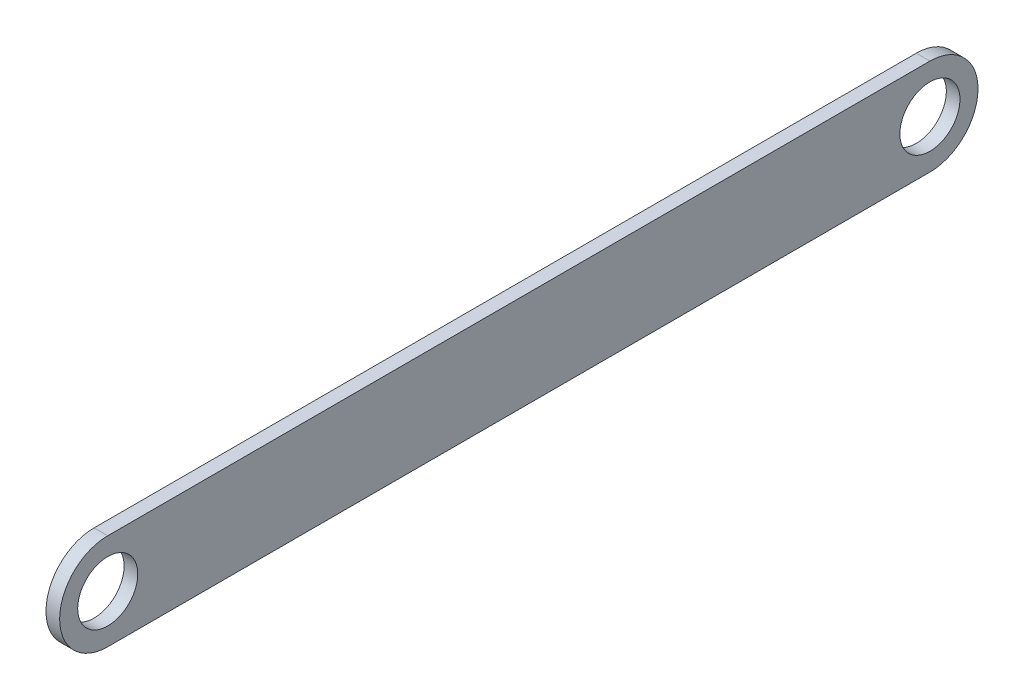
ISO-10303-21;
HEADER;
FILE_DESCRIPTION(('STEP AP214'),'2;1');
FILE_NAME('part.step','',(''),(''),'','','');
FILE_SCHEMA(('AUTOMOTIVE_DESIGN { 1 0 10303 214 1 1 1 1 }'));
ENDSEC;
DATA;
#1=APPLICATION_CONTEXT('core data for automotive mechanical design processes');
#2=APPLICATION_PROTOCOL_DEFINITION('international standard','automotive_design',2000,#1);
#3=PRODUCT_CONTEXT('',#1,'mechanical');
#4=PRODUCT('Part','Part','',(#3));
#5=PRODUCT_RELATED_PRODUCT_CATEGORY('part','',(#4));
#6=PRODUCT_DEFINITION_FORMATION('','',#4);
#7=PRODUCT_DEFINITION_CONTEXT('part definition',#1,'design');
#8=PRODUCT_DEFINITION('design','',#6,#7);
#9=PRODUCT_DEFINITION_SHAPE('','',#8);
#10=(LENGTH_UNIT() NAMED_UNIT(*) SI_UNIT(.MILLI.,.METRE.));
#11=(NAMED_UNIT(*) PLANE_ANGLE_UNIT() SI_UNIT($,.RADIAN.));
#12=(NAMED_UNIT(*) SI_UNIT($,.STERADIAN.) SOLID_ANGLE_UNIT());
#13=UNCERTAINTY_MEASURE_WITH_UNIT(LENGTH_MEASURE(1.E-05),#10,'distance_accuracy_value','');
#14=(GEOMETRIC_REPRESENTATION_CONTEXT(3) GLOBAL_UNCERTAINTY_ASSIGNED_CONTEXT((#13)) GLOBAL_UNIT_ASSIGNED_CONTEXT((#10,
#11,#12)) REPRESENTATION_CONTEXT('',''));
#15=CARTESIAN_POINT('',(0.,0.,0.));
#16=DIRECTION('',(0.,0.,1.));
#17=DIRECTION('',(1.,0.,0.));
#18=AXIS2_PLACEMENT_3D('',#15,#16,#17);
#19=CARTESIAN_POINT('',(28.829,0.,0.));
#20=DIRECTION('',(1.,0.,0.));
#21=DIRECTION('',(0.,0.,-1.));
#22=AXIS2_PLACEMENT_3D('',#19,#20,#21);
#23=PLANE('',#22);
#24=CARTESIAN_POINT('',(28.829,0.,0.));
#25=DIRECTION('',(1.,0.,0.));
#26=DIRECTION('',(0.,0.,-1.));
#27=AXIS2_PLACEMENT_3D('',#24,#25,#26);
#28=CIRCLE('',#27,63.5);
#29=CARTESIAN_POINT('',(28.829,0.,63.5));
#30=VERTEX_POINT('',#29);
#31=EDGE_CURVE('E100',#30,#30,#28,.T.);
#32=ORIENTED_EDGE('',*,*,#31,.F.);
#33=EDGE_LOOP('',(#32));
#34=FACE_BOUND('',#33,.T.);
#35=CARTESIAN_POINT('',(28.829,0.,0.));
#36=DIRECTION('',(1.,0.,0.));
#37=DIRECTION('',(0.,0.,-1.));
#38=AXIS2_PLACEMENT_3D('',#35,#36,#37);
#39=CIRCLE('',#38,101.6);
#40=CARTESIAN_POINT('',(28.829,101.6,0.));
#41=VERTEX_POINT('',#40);
#42=CARTESIAN_POINT('',(28.829,-101.6,0.));
#43=VERTEX_POINT('',#42);
#44=EDGE_CURVE('E85',#41,#43,#39,.T.);
#45=ORIENTED_EDGE('',*,*,#44,.T.);
#46=DIRECTION('',(0.,0.,-1.));
#47=VECTOR('',#46,1.);
#48=CARTESIAN_POINT('',(28.829,-101.6,0.));
#49=LINE('',#48,#47);
#50=CARTESIAN_POINT('',(28.829,-101.6,-1737.36));
#51=VERTEX_POINT('',#50);
#52=EDGE_CURVE('E80',#43,#51,#49,.T.);
#53=ORIENTED_EDGE('',*,*,#52,.T.);
#54=CARTESIAN_POINT('',(28.829,0.,-1737.36));
#55=DIRECTION('',(1.,0.,0.));
#56=DIRECTION('',(0.,0.,-1.));
#57=AXIS2_PLACEMENT_3D('',#54,#55,#56);
#58=CIRCLE('',#57,101.6);
#59=CARTESIAN_POINT('',(28.829,101.6,-1737.36));
#60=VERTEX_POINT('',#59);
#61=EDGE_CURVE('E83',#51,#60,#58,.T.);
#62=ORIENTED_EDGE('',*,*,#61,.T.);
#63=DIRECTION('',(0.,0.,1.));
#64=VECTOR('',#63,1.);
#65=CARTESIAN_POINT('',(28.829,101.6,0.));
#66=LINE('',#65,#64);
#67=EDGE_CURVE('E50',#60,#41,#66,.T.);
#68=ORIENTED_EDGE('',*,*,#67,.T.);
#69=EDGE_LOOP('',(#45,#53,#62,#68));
#70=FACE_BOUND('',#69,.T.);
#71=CARTESIAN_POINT('',(28.829,0.,-1737.36));
#72=DIRECTION('',(1.,0.,0.));
#73=DIRECTION('',(0.,0.,-1.));
#74=AXIS2_PLACEMENT_3D('',#71,#72,#73);
#75=CIRCLE('',#74,63.5000000000001);
#76=CARTESIAN_POINT('',(28.829,0.,-1673.86));
#77=VERTEX_POINT('',#76);
#78=EDGE_CURVE('E115',#77,#77,#75,.T.);
#79=ORIENTED_EDGE('',*,*,#78,.F.);
#80=EDGE_LOOP('',(#79));
#81=FACE_BOUND('',#80,.T.);
#82=ADVANCED_FACE('F33',(#34,#70,#81),#23,.T.);
#83=CARTESIAN_POINT('',(0.,0.,0.));
#84=DIRECTION('',(1.,0.,0.));
#85=DIRECTION('',(0.,0.,-1.));
#86=AXIS2_PLACEMENT_3D('',#83,#84,#85);
#87=PLANE('',#86);
#88=CARTESIAN_POINT('',(0.,0.,0.));
#89=DIRECTION('',(1.,0.,0.));
#90=DIRECTION('',(0.,0.,-1.));
#91=AXIS2_PLACEMENT_3D('',#88,#89,#90);
#92=CIRCLE('',#91,101.6);
#93=CARTESIAN_POINT('',(0.,101.6,0.));
#94=VERTEX_POINT('',#93);
#95=CARTESIAN_POINT('',(0.,-101.6,0.));
#96=VERTEX_POINT('',#95);
#97=EDGE_CURVE('E97',#94,#96,#92,.T.);
#98=ORIENTED_EDGE('',*,*,#97,.F.);
#99=DIRECTION('',(0.,0.,1.));
#100=VECTOR('',#99,1.);
#101=CARTESIAN_POINT('',(0.,101.6,0.));
#102=LINE('',#101,#100);
#103=CARTESIAN_POINT('',(0.,101.6,-1737.36));
#104=VERTEX_POINT('',#103);
#105=EDGE_CURVE('E73',#104,#94,#102,.T.);
#106=ORIENTED_EDGE('',*,*,#105,.F.);
#107=CARTESIAN_POINT('',(0.,0.,-1737.36));
#108=DIRECTION('',(1.,0.,0.));
#109=DIRECTION('',(0.,0.,-1.));
#110=AXIS2_PLACEMENT_3D('',#107,#108,#109);
#111=CIRCLE('',#110,101.6);
#112=CARTESIAN_POINT('',(0.,-101.6,-1737.36));
#113=VERTEX_POINT('',#112);
#114=EDGE_CURVE('E67',#113,#104,#111,.T.);
#115=ORIENTED_EDGE('',*,*,#114,.F.);
#116=DIRECTION('',(0.,0.,-1.));
#117=VECTOR('',#116,1.);
#118=CARTESIAN_POINT('',(0.,-101.6,0.));
#119=LINE('',#118,#117);
#120=EDGE_CURVE('E89',#96,#113,#119,.T.);
#121=ORIENTED_EDGE('',*,*,#120,.F.);
#122=EDGE_LOOP('',(#98,#106,#115,#121));
#123=FACE_BOUND('',#122,.T.);
#124=CARTESIAN_POINT('',(0.,0.,0.));
#125=DIRECTION('',(1.,0.,0.));
#126=DIRECTION('',(0.,0.,-1.));
#127=AXIS2_PLACEMENT_3D('',#124,#125,#126);
#128=CIRCLE('',#127,63.5);
#129=CARTESIAN_POINT('',(0.,0.,63.5));
#130=VERTEX_POINT('',#129);
#131=EDGE_CURVE('E112',#130,#130,#128,.T.);
#132=ORIENTED_EDGE('',*,*,#131,.T.);
#133=EDGE_LOOP('',(#132));
#134=FACE_BOUND('',#133,.T.);
#135=CARTESIAN_POINT('',(0.,0.,-1737.36));
#136=DIRECTION('',(1.,0.,0.));
#137=DIRECTION('',(0.,0.,-1.));
#138=AXIS2_PLACEMENT_3D('',#135,#136,#137);
#139=CIRCLE('',#138,63.5000000000001);
#140=CARTESIAN_POINT('',(0.,0.,-1673.86));
#141=VERTEX_POINT('',#140);
#142=EDGE_CURVE('E118',#141,#141,#139,.T.);
#143=ORIENTED_EDGE('',*,*,#142,.T.);
#144=EDGE_LOOP('',(#143));
#145=FACE_BOUND('',#144,.T.);
#146=ADVANCED_FACE('F108',(#123,#134,#145),#87,.F.);
#147=CARTESIAN_POINT('',(28.829,0.,0.));
#148=DIRECTION('',(-1.,0.,0.));
#149=DIRECTION('',(0.,0.,1.));
#150=AXIS2_PLACEMENT_3D('',#147,#148,#149);
#151=CYLINDRICAL_SURFACE('',#150,101.6);
#152=ORIENTED_EDGE('',*,*,#97,.T.);
#153=DIRECTION('',(-1.,0.,0.));
#154=VECTOR('',#153,1.);
#155=CARTESIAN_POINT('',(28.829,-101.6,0.));
#156=LINE('',#155,#154);
#157=EDGE_CURVE('E11',#43,#96,#156,.T.);
#158=ORIENTED_EDGE('',*,*,#157,.F.);
#159=ORIENTED_EDGE('',*,*,#44,.F.);
#160=DIRECTION('',(-1.,0.,0.));
#161=VECTOR('',#160,1.);
#162=CARTESIAN_POINT('',(28.829,101.6,0.));
#163=LINE('',#162,#161);
#164=EDGE_CURVE('E93',#41,#94,#163,.T.);
#165=ORIENTED_EDGE('',*,*,#164,.T.);
#166=EDGE_LOOP('',(#152,#158,#159,#165));
#167=FACE_BOUND('',#166,.T.);
#168=ADVANCED_FACE('F35',(#167),#151,.T.);
#169=CARTESIAN_POINT('',(28.829,-101.6,0.));
#170=DIRECTION('',(0.,1.,0.));
#171=DIRECTION('',(0.,0.,1.));
#172=AXIS2_PLACEMENT_3D('',#169,#170,#171);
#173=PLANE('',#172);
#174=ORIENTED_EDGE('',*,*,#120,.T.);
#175=DIRECTION('',(-1.,0.,0.));
#176=VECTOR('',#175,1.);
#177=CARTESIAN_POINT('',(28.829,-101.6,-1737.36));
#178=LINE('',#177,#176);
#179=EDGE_CURVE('E42',#51,#113,#178,.T.);
#180=ORIENTED_EDGE('',*,*,#179,.F.);
#181=ORIENTED_EDGE('',*,*,#52,.F.);
#182=ORIENTED_EDGE('',*,*,#157,.T.);
#183=EDGE_LOOP('',(#174,#180,#181,#182));
#184=FACE_BOUND('',#183,.T.);
#185=ADVANCED_FACE('F88',(#184),#173,.F.);
#186=CARTESIAN_POINT('',(28.829,0.,-1737.36));
#187=DIRECTION('',(-1.,0.,0.));
#188=DIRECTION('',(0.,0.,1.));
#189=AXIS2_PLACEMENT_3D('',#186,#187,#188);
#190=CYLINDRICAL_SURFACE('',#189,101.6);
#191=ORIENTED_EDGE('',*,*,#114,.T.);
#192=DIRECTION('',(-1.,0.,0.));
#193=VECTOR('',#192,1.);
#194=CARTESIAN_POINT('',(28.829,101.6,-1737.36));
#195=LINE('',#194,#193);
#196=EDGE_CURVE('E90',#60,#104,#195,.T.);
#197=ORIENTED_EDGE('',*,*,#196,.F.);
#198=ORIENTED_EDGE('',*,*,#61,.F.);
#199=ORIENTED_EDGE('',*,*,#179,.T.);
#200=EDGE_LOOP('',(#191,#197,#198,#199));
#201=FACE_BOUND('',#200,.T.);
#202=ADVANCED_FACE('F91',(#201),#190,.T.);
#203=CARTESIAN_POINT('',(28.829,101.6,0.));
#204=DIRECTION('',(0.,-1.,0.));
#205=DIRECTION('',(0.,0.,-1.));
#206=AXIS2_PLACEMENT_3D('',#203,#204,#205);
#207=PLANE('',#206);
#208=ORIENTED_EDGE('',*,*,#105,.T.);
#209=ORIENTED_EDGE('',*,*,#164,.F.);
#210=ORIENTED_EDGE('',*,*,#67,.F.);
#211=ORIENTED_EDGE('',*,*,#196,.T.);
#212=EDGE_LOOP('',(#208,#209,#210,#211));
#213=FACE_BOUND('',#212,.T.);
#214=ADVANCED_FACE('F105',(#213),#207,.F.);
#215=CARTESIAN_POINT('',(28.829,0.,0.));
#216=DIRECTION('',(-1.,0.,0.));
#217=DIRECTION('',(0.,0.,1.));
#218=AXIS2_PLACEMENT_3D('',#215,#216,#217);
#219=CYLINDRICAL_SURFACE('',#218,63.5);
#220=CARTESIAN_POINT('',(28.829,0.,63.5));
#221=CARTESIAN_POINT('',(28.5286979166667,0.,63.5));
#222=CARTESIAN_POINT('',(28.2283958333333,0.,63.5));
#223=CARTESIAN_POINT('',(27.6277916666667,0.,63.5));
#224=CARTESIAN_POINT('',(27.3274895833333,0.,63.5));
#225=CARTESIAN_POINT('',(26.7268854166667,0.,63.5));
#226=CARTESIAN_POINT('',(26.4265833333333,0.,63.5));
#227=CARTESIAN_POINT('',(25.8259791666667,0.,63.5));
#228=CARTESIAN_POINT('',(25.5256770833333,0.,63.5));
#229=CARTESIAN_POINT('',(24.9250729166667,0.,63.5));
#230=CARTESIAN_POINT('',(24.6247708333333,0.,63.5));
#231=CARTESIAN_POINT('',(24.0241666666667,0.,63.5));
#232=CARTESIAN_POINT('',(23.7238645833333,0.,63.5));
#233=CARTESIAN_POINT('',(23.1232604166667,0.,63.5));
#234=CARTESIAN_POINT('',(22.8229583333333,0.,63.5));
#235=CARTESIAN_POINT('',(22.2223541666667,0.,63.5));
#236=CARTESIAN_POINT('',(21.9220520833333,0.,63.5));
#237=CARTESIAN_POINT('',(21.3214479166667,0.,63.5));
#238=CARTESIAN_POINT('',(21.0211458333333,0.,63.5));
#239=CARTESIAN_POINT('',(20.4205416666667,0.,63.5));
#240=CARTESIAN_POINT('',(20.1202395833333,0.,63.5));
#241=CARTESIAN_POINT('',(19.5196354166667,0.,63.5));
#242=CARTESIAN_POINT('',(19.2193333333333,0.,63.5));
#243=CARTESIAN_POINT('',(18.6187291666667,0.,63.5));
#244=CARTESIAN_POINT('',(18.3184270833333,0.,63.5));
#245=CARTESIAN_POINT('',(17.7178229166667,0.,63.5));
#246=CARTESIAN_POINT('',(17.4175208333333,0.,63.5));
#247=CARTESIAN_POINT('',(16.8169166666667,0.,63.5));
#248=CARTESIAN_POINT('',(16.5166145833333,0.,63.5));
#249=CARTESIAN_POINT('',(15.9160104166667,0.,63.5));
#250=CARTESIAN_POINT('',(15.6157083333333,0.,63.5));
#251=CARTESIAN_POINT('',(15.0151041666667,0.,63.5));
#252=CARTESIAN_POINT('',(14.7148020833333,0.,63.5));
#253=CARTESIAN_POINT('',(14.1141979166667,0.,63.5));
#254=CARTESIAN_POINT('',(13.8138958333333,0.,63.5));
#255=CARTESIAN_POINT('',(13.2132916666667,0.,63.5));
#256=CARTESIAN_POINT('',(12.9129895833333,0.,63.5));
#257=CARTESIAN_POINT('',(12.3123854166667,0.,63.5));
#258=CARTESIAN_POINT('',(12.0120833333333,0.,63.5));
#259=CARTESIAN_POINT('',(11.4114791666667,0.,63.5));
#260=CARTESIAN_POINT('',(11.1111770833333,0.,63.5));
#261=CARTESIAN_POINT('',(10.5105729166667,0.,63.5));
#262=CARTESIAN_POINT('',(10.2102708333333,0.,63.5));
#263=CARTESIAN_POINT('',(9.60966666666666,0.,63.5));
#264=CARTESIAN_POINT('',(9.30936458333333,0.,63.5));
#265=CARTESIAN_POINT('',(8.70876041666666,0.,63.5));
#266=CARTESIAN_POINT('',(8.40845833333333,0.,63.5));
#267=CARTESIAN_POINT('',(7.80785416666667,0.,63.5));
#268=CARTESIAN_POINT('',(7.50755208333333,0.,63.5));
#269=CARTESIAN_POINT('',(6.90694791666666,0.,63.5));
#270=CARTESIAN_POINT('',(6.60664583333333,0.,63.5));
#271=CARTESIAN_POINT('',(6.00604166666667,0.,63.5));
#272=CARTESIAN_POINT('',(5.70573958333333,0.,63.5));
#273=CARTESIAN_POINT('',(5.10513541666667,0.,63.5));
#274=CARTESIAN_POINT('',(4.80483333333333,0.,63.5));
#275=CARTESIAN_POINT('',(4.20422916666666,0.,63.5));
#276=CARTESIAN_POINT('',(3.90392708333333,0.,63.5));
#277=CARTESIAN_POINT('',(3.30332291666666,0.,63.5));
#278=CARTESIAN_POINT('',(3.00302083333333,0.,63.5));
#279=CARTESIAN_POINT('',(2.40241666666666,0.,63.5));
#280=CARTESIAN_POINT('',(2.10211458333333,0.,63.5));
#281=CARTESIAN_POINT('',(1.50151041666666,0.,63.5));
#282=CARTESIAN_POINT('',(1.20120833333333,0.,63.5));
#283=CARTESIAN_POINT('',(0.600604166666663,0.,63.5));
#284=CARTESIAN_POINT('',(0.300302083333329,0.,63.5));
#285=CARTESIAN_POINT('',(0.,0.,63.5));
#286=B_SPLINE_CURVE_WITH_KNOTS('',3,(#220,#221,#222,#223,#224,#225,#226,#227,#228,#229,#230,
#231,#232,#233,#234,#235,#236,#237,#238,#239,#240,#241,#242,#243,#244,#245,#246,#247,#248,#249,
#250,#251,#252,#253,#254,#255,#256,#257,#258,#259,#260,#261,#262,#263,#264,#265,#266,#267,#268,
#269,#270,#271,#272,#273,#274,#275,#276,#277,#278,#279,#280,#281,#282,#283,#284,#285),
.UNSPECIFIED.,.F.,.F.,(4,2,2,2,2,2,2,2,2,2,2,2,2,2,2,2,2,2,2,2,2,2,2,2,2,2,2,2,2,2,2,2,4),(0.,
0.900906250000003,1.8018125,2.70271875,3.603625,4.50453125,5.4054375,6.30634375,7.20725,
8.10815625,9.0090625,9.90996875,10.810875,11.71178125,12.6126875,13.51359375,14.4145,
15.31540625,16.2163125,17.11721875,18.018125,18.91903125,19.8199375,20.72084375,21.62175,
22.52265625,23.4235625,24.32446875,25.225375,26.12628125,27.0271875,27.92809375,28.829),.UNSPECIFIED.);
#287=EDGE_CURVE('BSEAM135',#30,#130,#286,.T.);
#288=ORIENTED_EDGE('',*,*,#31,.T.);
#289=ORIENTED_EDGE('',*,*,#131,.F.);
#290=ORIENTED_EDGE('',*,*,#287,.T.);
#291=ORIENTED_EDGE('',*,*,#287,.F.);
#292=EDGE_LOOP('',(#288,#290,#289,#291));
#293=FACE_BOUND('',#292,.T.);
#294=ADVANCED_FACE('F135',(#293),#219,.F.);
#295=CARTESIAN_POINT('',(28.829,0.,-1737.36));
#296=DIRECTION('',(-1.,0.,0.));
#297=DIRECTION('',(0.,0.,1.));
#298=AXIS2_PLACEMENT_3D('',#295,#296,#297);
#299=CYLINDRICAL_SURFACE('',#298,63.5000000000001);
#300=CARTESIAN_POINT('',(28.829,0.,-1673.86));
#301=CARTESIAN_POINT('',(28.5286979166667,0.,-1673.86));
#302=CARTESIAN_POINT('',(28.2283958333333,0.,-1673.86));
#303=CARTESIAN_POINT('',(27.6277916666667,0.,-1673.86));
#304=CARTESIAN_POINT('',(27.3274895833333,0.,-1673.86));
#305=CARTESIAN_POINT('',(26.7268854166667,0.,-1673.86));
#306=CARTESIAN_POINT('',(26.4265833333333,0.,-1673.86));
#307=CARTESIAN_POINT('',(25.8259791666667,0.,-1673.86));
#308=CARTESIAN_POINT('',(25.5256770833333,0.,-1673.86));
#309=CARTESIAN_POINT('',(24.9250729166667,0.,-1673.86));
#310=CARTESIAN_POINT('',(24.6247708333333,0.,-1673.86));
#311=CARTESIAN_POINT('',(24.0241666666667,0.,-1673.86));
#312=CARTESIAN_POINT('',(23.7238645833333,0.,-1673.86));
#313=CARTESIAN_POINT('',(23.1232604166667,0.,-1673.86));
#314=CARTESIAN_POINT('',(22.8229583333333,0.,-1673.86));
#315=CARTESIAN_POINT('',(22.2223541666667,0.,-1673.86));
#316=CARTESIAN_POINT('',(21.9220520833333,0.,-1673.86));
#317=CARTESIAN_POINT('',(21.3214479166667,0.,-1673.86));
#318=CARTESIAN_POINT('',(21.0211458333333,0.,-1673.86));
#319=CARTESIAN_POINT('',(20.4205416666667,0.,-1673.86));
#320=CARTESIAN_POINT('',(20.1202395833333,0.,-1673.86));
#321=CARTESIAN_POINT('',(19.5196354166667,0.,-1673.86));
#322=CARTESIAN_POINT('',(19.2193333333333,0.,-1673.86));
#323=CARTESIAN_POINT('',(18.6187291666667,0.,-1673.86));
#324=CARTESIAN_POINT('',(18.3184270833333,0.,-1673.86));
#325=CARTESIAN_POINT('',(17.7178229166667,0.,-1673.86));
#326=CARTESIAN_POINT('',(17.4175208333333,0.,-1673.86));
#327=CARTESIAN_POINT('',(16.8169166666667,0.,-1673.86));
#328=CARTESIAN_POINT('',(16.5166145833333,0.,-1673.86));
#329=CARTESIAN_POINT('',(15.9160104166667,0.,-1673.86));
#330=CARTESIAN_POINT('',(15.6157083333333,0.,-1673.86));
#331=CARTESIAN_POINT('',(15.0151041666667,0.,-1673.86));
#332=CARTESIAN_POINT('',(14.7148020833333,0.,-1673.86));
#333=CARTESIAN_POINT('',(14.1141979166667,0.,-1673.86));
#334=CARTESIAN_POINT('',(13.8138958333333,0.,-1673.86));
#335=CARTESIAN_POINT('',(13.2132916666667,0.,-1673.86));
#336=CARTESIAN_POINT('',(12.9129895833333,0.,-1673.86));
#337=CARTESIAN_POINT('',(12.3123854166667,0.,-1673.86));
#338=CARTESIAN_POINT('',(12.0120833333333,0.,-1673.86));
#339=CARTESIAN_POINT('',(11.4114791666667,0.,-1673.86));
#340=CARTESIAN_POINT('',(11.1111770833333,0.,-1673.86));
#341=CARTESIAN_POINT('',(10.5105729166667,0.,-1673.86));
#342=CARTESIAN_POINT('',(10.2102708333333,0.,-1673.86));
#343=CARTESIAN_POINT('',(9.60966666666666,0.,-1673.86));
#344=CARTESIAN_POINT('',(9.30936458333333,0.,-1673.86));
#345=CARTESIAN_POINT('',(8.70876041666666,0.,-1673.86));
#346=CARTESIAN_POINT('',(8.40845833333333,0.,-1673.86));
#347=CARTESIAN_POINT('',(7.80785416666667,0.,-1673.86));
#348=CARTESIAN_POINT('',(7.50755208333333,0.,-1673.86));
#349=CARTESIAN_POINT('',(6.90694791666666,0.,-1673.86));
#350=CARTESIAN_POINT('',(6.60664583333333,0.,-1673.86));
#351=CARTESIAN_POINT('',(6.00604166666667,0.,-1673.86));
#352=CARTESIAN_POINT('',(5.70573958333333,0.,-1673.86));
#353=CARTESIAN_POINT('',(5.10513541666667,0.,-1673.86));
#354=CARTESIAN_POINT('',(4.80483333333333,0.,-1673.86));
#355=CARTESIAN_POINT('',(4.20422916666666,0.,-1673.86));
#356=CARTESIAN_POINT('',(3.90392708333333,0.,-1673.86));
#357=CARTESIAN_POINT('',(3.30332291666666,0.,-1673.86));
#358=CARTESIAN_POINT('',(3.00302083333333,0.,-1673.86));
#359=CARTESIAN_POINT('',(2.40241666666666,0.,-1673.86));
#360=CARTESIAN_POINT('',(2.10211458333333,0.,-1673.86));
#361=CARTESIAN_POINT('',(1.50151041666666,0.,-1673.86));
#362=CARTESIAN_POINT('',(1.20120833333333,0.,-1673.86));
#363=CARTESIAN_POINT('',(0.600604166666663,0.,-1673.86));
#364=CARTESIAN_POINT('',(0.300302083333329,0.,-1673.86));
#365=CARTESIAN_POINT('',(0.,0.,-1673.86));
#366=B_SPLINE_CURVE_WITH_KNOTS('',3,(#300,#301,#302,#303,#304,#305,#306,#307,#308,#309,#310,
#311,#312,#313,#314,#315,#316,#317,#318,#319,#320,#321,#322,#323,#324,#325,#326,#327,#328,#329,
#330,#331,#332,#333,#334,#335,#336,#337,#338,#339,#340,#341,#342,#343,#344,#345,#346,#347,#348,
#349,#350,#351,#352,#353,#354,#355,#356,#357,#358,#359,#360,#361,#362,#363,#364,#365),
.UNSPECIFIED.,.F.,.F.,(4,2,2,2,2,2,2,2,2,2,2,2,2,2,2,2,2,2,2,2,2,2,2,2,2,2,2,2,2,2,2,2,4),(0.,
0.900906250000003,1.8018125,2.70271875,3.603625,4.50453125,5.4054375,6.30634375,7.20725,
8.10815625,9.0090625,9.90996875,10.810875,11.71178125,12.6126875,13.51359375,14.4145,
15.31540625,16.2163125,17.11721875,18.018125,18.91903125,19.8199375,20.72084375,21.62175,
22.52265625,23.4235625,24.32446875,25.225375,26.12628125,27.0271875,27.92809375,28.829),.UNSPECIFIED.);
#367=EDGE_CURVE('BSEAM124',#77,#141,#366,.T.);
#368=ORIENTED_EDGE('',*,*,#78,.T.);
#369=ORIENTED_EDGE('',*,*,#142,.F.);
#370=ORIENTED_EDGE('',*,*,#367,.T.);
#371=ORIENTED_EDGE('',*,*,#367,.F.);
#372=EDGE_LOOP('',(#368,#370,#369,#371));
#373=FACE_BOUND('',#372,.T.);
#374=ADVANCED_FACE('F124',(#373),#299,.F.);
#375=CLOSED_SHELL('',(#82,#146,#168,#185,#202,#214,#294,#374));
#376=MANIFOLD_SOLID_BREP('B2',#375);
#377=ADVANCED_BREP_SHAPE_REPRESENTATION('',(#18,#376),#14);
#378=SHAPE_DEFINITION_REPRESENTATION(#9,#377);
ENDSEC;
END-ISO-10303-21;
